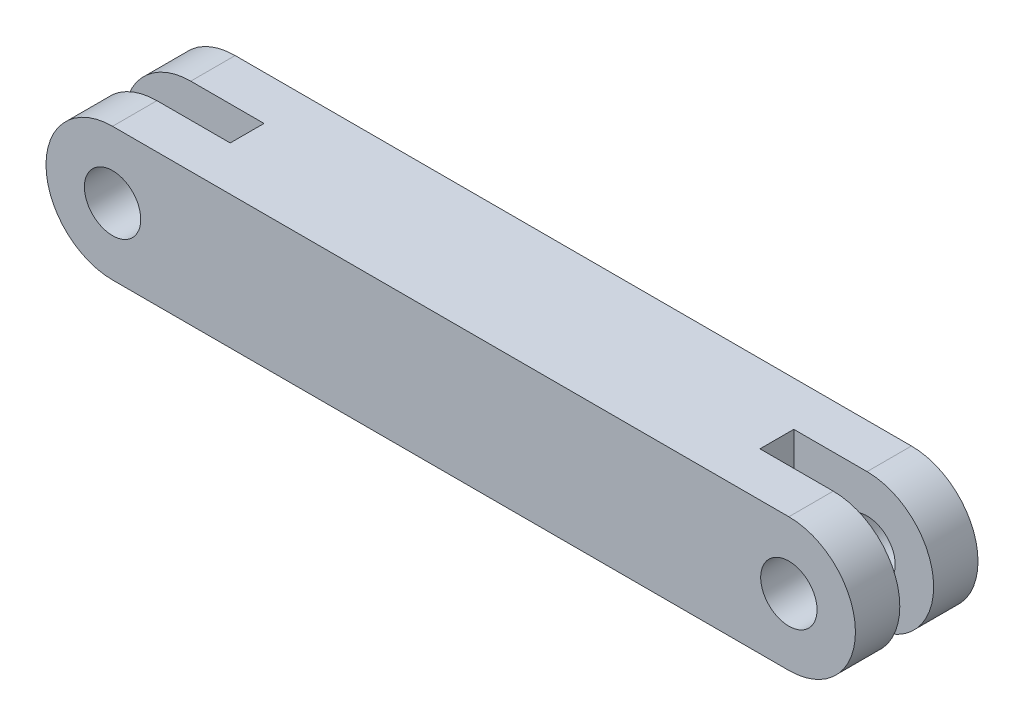
ISO-10303-21;
HEADER;
FILE_DESCRIPTION(('STEP AP214'),'2;1');
FILE_NAME('part.step','',(''),(''),'','','');
FILE_SCHEMA(('AUTOMOTIVE_DESIGN { 1 0 10303 214 1 1 1 1 }'));
ENDSEC;
DATA;
#1=APPLICATION_CONTEXT('core data for automotive mechanical design processes');
#2=APPLICATION_PROTOCOL_DEFINITION('international standard','automotive_design',2000,#1);
#3=PRODUCT_CONTEXT('',#1,'mechanical');
#4=PRODUCT('Part','Part','',(#3));
#5=PRODUCT_RELATED_PRODUCT_CATEGORY('part','',(#4));
#6=PRODUCT_DEFINITION_FORMATION('','',#4);
#7=PRODUCT_DEFINITION_CONTEXT('part definition',#1,'design');
#8=PRODUCT_DEFINITION('design','',#6,#7);
#9=PRODUCT_DEFINITION_SHAPE('','',#8);
#10=(LENGTH_UNIT() NAMED_UNIT(*) SI_UNIT(.MILLI.,.METRE.));
#11=(NAMED_UNIT(*) PLANE_ANGLE_UNIT() SI_UNIT($,.RADIAN.));
#12=(NAMED_UNIT(*) SI_UNIT($,.STERADIAN.) SOLID_ANGLE_UNIT());
#13=UNCERTAINTY_MEASURE_WITH_UNIT(LENGTH_MEASURE(1.E-05),#10,'distance_accuracy_value','');
#14=(GEOMETRIC_REPRESENTATION_CONTEXT(3) GLOBAL_UNCERTAINTY_ASSIGNED_CONTEXT((#13)) GLOBAL_UNIT_ASSIGNED_CONTEXT((#10,
#11,#12)) REPRESENTATION_CONTEXT('',''));
#15=CARTESIAN_POINT('',(0.,0.,0.));
#16=DIRECTION('',(0.,0.,1.));
#17=DIRECTION('',(1.,0.,0.));
#18=AXIS2_PLACEMENT_3D('',#15,#16,#17);
#19=CARTESIAN_POINT('',(-47.2173913043478,0.423913043478259,5.));
#20=DIRECTION('',(0.,0.,1.));
#21=DIRECTION('',(1.,0.,0.));
#22=AXIS2_PLACEMENT_3D('',#19,#20,#21);
#23=PLANE('',#22);
#24=DIRECTION('',(0.,1.,0.));
#25=VECTOR('',#24,1.);
#26=CARTESIAN_POINT('',(20.7276086956522,-7.07608695652173,5.));
#27=LINE('',#26,#25);
#28=CARTESIAN_POINT('',(20.7276086956522,-7.07608695652174,5.));
#29=VERTEX_POINT('',#28);
#30=CARTESIAN_POINT('',(20.7276086956522,7.92391304347826,5.));
#31=VERTEX_POINT('',#30);
#32=EDGE_CURVE('E166',#29,#31,#27,.T.);
#33=ORIENTED_EDGE('',*,*,#32,.F.);
#34=DIRECTION('',(1.,0.,0.));
#35=VECTOR('',#34,1.);
#36=CARTESIAN_POINT('',(-47.2173913043478,-7.07608695652174,5.));
#37=LINE('',#36,#35);
#38=CARTESIAN_POINT('',(28.9826086956522,-7.07608695652174,5.));
#39=VERTEX_POINT('',#38);
#40=EDGE_CURVE('E223',#29,#39,#37,.T.);
#41=ORIENTED_EDGE('',*,*,#40,.T.);
#42=CARTESIAN_POINT('',(28.9826086956522,0.423913043478259,5.));
#43=DIRECTION('',(0.,0.,1.));
#44=DIRECTION('',(1.,0.,0.));
#45=AXIS2_PLACEMENT_3D('',#42,#43,#44);
#46=CIRCLE('',#45,7.5);
#47=CARTESIAN_POINT('',(28.9826086956522,7.92391304347826,5.));
#48=VERTEX_POINT('',#47);
#49=EDGE_CURVE('E228',#39,#48,#46,.T.);
#50=ORIENTED_EDGE('',*,*,#49,.T.);
#51=DIRECTION('',(-1.,0.,0.));
#52=VECTOR('',#51,1.);
#53=CARTESIAN_POINT('',(-47.2173913043478,7.92391304347826,5.));
#54=LINE('',#53,#52);
#55=EDGE_CURVE('E66',#48,#31,#54,.T.);
#56=ORIENTED_EDGE('',*,*,#55,.T.);
#57=EDGE_LOOP('',(#33,#41,#50,#56));
#58=FACE_BOUND('',#57,.T.);
#59=CARTESIAN_POINT('',(28.9826086956522,0.423913043478259,5.));
#60=DIRECTION('',(0.,0.,1.));
#61=DIRECTION('',(1.,0.,0.));
#62=AXIS2_PLACEMENT_3D('',#59,#60,#61);
#63=CIRCLE('',#62,3.175);
#64=CARTESIAN_POINT('',(32.1576086956522,0.423913043478259,5.));
#65=VERTEX_POINT('',#64);
#66=EDGE_CURVE('E203',#65,#65,#63,.T.);
#67=ORIENTED_EDGE('',*,*,#66,.F.);
#68=EDGE_LOOP('',(#67));
#69=FACE_BOUND('',#68,.T.);
#70=ADVANCED_FACE('F44',(#58,#69),#23,.T.);
#71=DIRECTION('',(0.,-1.,0.));
#72=VECTOR('',#71,1.);
#73=CARTESIAN_POINT('',(-38.9623913043478,-7.07608695652172,5.));
#74=LINE('',#73,#72);
#75=CARTESIAN_POINT('',(-38.9623913043478,7.92391304347826,5.));
#76=VERTEX_POINT('',#75);
#77=CARTESIAN_POINT('',(-38.9623913043478,-7.07608695652172,5.));
#78=VERTEX_POINT('',#77);
#79=EDGE_CURVE('E62',#76,#78,#74,.T.);
#80=ORIENTED_EDGE('',*,*,#79,.F.);
#81=CARTESIAN_POINT('',(-47.2173913043478,7.92391304347826,5.));
#82=VERTEX_POINT('',#81);
#83=EDGE_CURVE('E230',#76,#82,#54,.T.);
#84=ORIENTED_EDGE('',*,*,#83,.T.);
#85=CARTESIAN_POINT('',(-47.2173913043478,0.423913043478259,5.));
#86=DIRECTION('',(0.,0.,1.));
#87=DIRECTION('',(1.,0.,0.));
#88=AXIS2_PLACEMENT_3D('',#85,#86,#87);
#89=CIRCLE('',#88,7.5);
#90=CARTESIAN_POINT('',(-47.2173913043478,-7.07608695652174,5.));
#91=VERTEX_POINT('',#90);
#92=EDGE_CURVE('E220',#82,#91,#89,.T.);
#93=ORIENTED_EDGE('',*,*,#92,.T.);
#94=EDGE_CURVE('E221',#91,#78,#37,.T.);
#95=ORIENTED_EDGE('',*,*,#94,.T.);
#96=EDGE_LOOP('',(#80,#84,#93,#95));
#97=FACE_BOUND('',#96,.T.);
#98=CARTESIAN_POINT('',(-47.2173913043478,0.423913043478259,5.));
#99=DIRECTION('',(0.,0.,1.));
#100=DIRECTION('',(1.,0.,0.));
#101=AXIS2_PLACEMENT_3D('',#98,#99,#100);
#102=CIRCLE('',#101,3.175);
#103=CARTESIAN_POINT('',(-44.0423913043478,0.423913043478259,5.));
#104=VERTEX_POINT('',#103);
#105=EDGE_CURVE('E209',#104,#104,#102,.T.);
#106=ORIENTED_EDGE('',*,*,#105,.F.);
#107=EDGE_LOOP('',(#106));
#108=FACE_BOUND('',#107,.T.);
#109=ADVANCED_FACE('F267',(#97,#108),#23,.T.);
#110=CARTESIAN_POINT('',(-47.2173913043478,0.423913043478259,0.));
#111=DIRECTION('',(0.,0.,1.));
#112=DIRECTION('',(1.,0.,0.));
#113=AXIS2_PLACEMENT_3D('',#110,#111,#112);
#114=PLANE('',#113);
#115=CARTESIAN_POINT('',(-47.2173913043478,0.423913043478259,0.));
#116=DIRECTION('',(0.,0.,1.));
#117=DIRECTION('',(1.,0.,0.));
#118=AXIS2_PLACEMENT_3D('',#115,#116,#117);
#119=CIRCLE('',#118,7.5);
#120=CARTESIAN_POINT('',(-47.2173913043478,7.92391304347826,0.));
#121=VERTEX_POINT('',#120);
#122=CARTESIAN_POINT('',(-47.2173913043478,-7.07608695652174,0.));
#123=VERTEX_POINT('',#122);
#124=EDGE_CURVE('E214',#121,#123,#119,.T.);
#125=ORIENTED_EDGE('',*,*,#124,.F.);
#126=DIRECTION('',(-1.,0.,0.));
#127=VECTOR('',#126,1.);
#128=CARTESIAN_POINT('',(-47.2173913043478,7.92391304347826,0.));
#129=LINE('',#128,#127);
#130=CARTESIAN_POINT('',(28.9826086956522,7.92391304347826,0.));
#131=VERTEX_POINT('',#130);
#132=EDGE_CURVE('E225',#131,#121,#129,.T.);
#133=ORIENTED_EDGE('',*,*,#132,.F.);
#134=CARTESIAN_POINT('',(28.9826086956522,0.423913043478259,0.));
#135=DIRECTION('',(0.,0.,1.));
#136=DIRECTION('',(1.,0.,0.));
#137=AXIS2_PLACEMENT_3D('',#134,#135,#136);
#138=CIRCLE('',#137,7.5);
#139=CARTESIAN_POINT('',(28.9826086956522,-7.07608695652174,0.));
#140=VERTEX_POINT('',#139);
#141=EDGE_CURVE('E237',#140,#131,#138,.T.);
#142=ORIENTED_EDGE('',*,*,#141,.F.);
#143=DIRECTION('',(1.,0.,0.));
#144=VECTOR('',#143,1.);
#145=CARTESIAN_POINT('',(-47.2173913043478,-7.07608695652174,0.));
#146=LINE('',#145,#144);
#147=EDGE_CURVE('E236',#123,#140,#146,.T.);
#148=ORIENTED_EDGE('',*,*,#147,.F.);
#149=EDGE_LOOP('',(#125,#133,#142,#148));
#150=FACE_BOUND('',#149,.T.);
#151=CARTESIAN_POINT('',(-47.2173913043478,0.423913043478259,0.));
#152=DIRECTION('',(0.,0.,1.));
#153=DIRECTION('',(1.,0.,0.));
#154=AXIS2_PLACEMENT_3D('',#151,#152,#153);
#155=CIRCLE('',#154,3.175);
#156=CARTESIAN_POINT('',(-44.0423913043478,0.423913043478259,0.));
#157=VERTEX_POINT('',#156);
#158=EDGE_CURVE('E202',#157,#157,#155,.T.);
#159=ORIENTED_EDGE('',*,*,#158,.T.);
#160=EDGE_LOOP('',(#159));
#161=FACE_BOUND('',#160,.T.);
#162=CARTESIAN_POINT('',(28.9826086956522,0.423913043478259,0.));
#163=DIRECTION('',(0.,0.,1.));
#164=DIRECTION('',(1.,0.,0.));
#165=AXIS2_PLACEMENT_3D('',#162,#163,#164);
#166=CIRCLE('',#165,3.175);
#167=CARTESIAN_POINT('',(32.1576086956522,0.423913043478259,0.));
#168=VERTEX_POINT('',#167);
#169=EDGE_CURVE('E198',#168,#168,#166,.T.);
#170=ORIENTED_EDGE('',*,*,#169,.T.);
#171=EDGE_LOOP('',(#170));
#172=FACE_BOUND('',#171,.T.);
#173=ADVANCED_FACE('F265',(#150,#161,#172),#114,.F.);
#174=CARTESIAN_POINT('',(-47.2173913043478,0.423913043478259,5.));
#175=DIRECTION('',(0.,0.,-1.));
#176=DIRECTION('',(-1.,0.,0.));
#177=AXIS2_PLACEMENT_3D('',#174,#175,#176);
#178=CYLINDRICAL_SURFACE('',#177,7.5);
#179=ORIENTED_EDGE('',*,*,#124,.T.);
#180=DIRECTION('',(0.,0.,-1.));
#181=VECTOR('',#180,1.);
#182=CARTESIAN_POINT('',(-47.2173913043478,-7.07608695652174,5.));
#183=LINE('',#182,#181);
#184=EDGE_CURVE('E11',#91,#123,#183,.T.);
#185=ORIENTED_EDGE('',*,*,#184,.F.);
#186=ORIENTED_EDGE('',*,*,#92,.F.);
#187=DIRECTION('',(0.,0.,-1.));
#188=VECTOR('',#187,1.);
#189=CARTESIAN_POINT('',(-47.2173913043478,7.92391304347826,5.));
#190=LINE('',#189,#188);
#191=EDGE_CURVE('E235',#82,#121,#190,.T.);
#192=ORIENTED_EDGE('',*,*,#191,.T.);
#193=EDGE_LOOP('',(#179,#185,#186,#192));
#194=FACE_BOUND('',#193,.T.);
#195=ADVANCED_FACE('F50',(#194),#178,.T.);
#196=CARTESIAN_POINT('',(-47.2173913043478,-7.07608695652174,5.));
#197=DIRECTION('',(0.,1.,0.));
#198=DIRECTION('',(-1.,0.,0.));
#199=AXIS2_PLACEMENT_3D('',#196,#197,#198);
#200=PLANE('',#199);
#201=ORIENTED_EDGE('',*,*,#147,.T.);
#202=DIRECTION('',(0.,0.,-1.));
#203=VECTOR('',#202,1.);
#204=CARTESIAN_POINT('',(28.9826086956522,-7.07608695652174,5.));
#205=LINE('',#204,#203);
#206=EDGE_CURVE('E53',#39,#140,#205,.T.);
#207=ORIENTED_EDGE('',*,*,#206,.F.);
#208=ORIENTED_EDGE('',*,*,#40,.F.);
#209=DIRECTION('',(0.,0.,-1.));
#210=VECTOR('',#209,1.);
#211=CARTESIAN_POINT('',(20.7276086956522,-7.07608695652173,8.81));
#212=LINE('',#211,#210);
#213=CARTESIAN_POINT('',(20.7276086956522,-7.07608695652173,8.81));
#214=VERTEX_POINT('',#213);
#215=EDGE_CURVE('E189',#214,#29,#212,.T.);
#216=ORIENTED_EDGE('',*,*,#215,.F.);
#217=DIRECTION('',(1.,0.,0.));
#218=VECTOR('',#217,1.);
#219=CARTESIAN_POINT('',(-47.2173913043478,-7.07608695652174,8.81));
#220=LINE('',#219,#218);
#221=CARTESIAN_POINT('',(28.9826086956522,-7.07608695652174,8.81));
#222=VERTEX_POINT('',#221);
#223=EDGE_CURVE('E281',#214,#222,#220,.T.);
#224=ORIENTED_EDGE('',*,*,#223,.T.);
#225=DIRECTION('',(0.,0.,-1.));
#226=VECTOR('',#225,1.);
#227=CARTESIAN_POINT('',(28.9826086956522,-7.07608695652174,13.81));
#228=LINE('',#227,#226);
#229=CARTESIAN_POINT('',(28.9826086956522,-7.07608695652174,13.81));
#230=VERTEX_POINT('',#229);
#231=EDGE_CURVE('E141',#230,#222,#228,.T.);
#232=ORIENTED_EDGE('',*,*,#231,.F.);
#233=DIRECTION('',(1.,0.,0.));
#234=VECTOR('',#233,1.);
#235=CARTESIAN_POINT('',(-47.2173913043478,-7.07608695652174,13.81));
#236=LINE('',#235,#234);
#237=CARTESIAN_POINT('',(-47.2173913043478,-7.07608695652174,13.81));
#238=VERTEX_POINT('',#237);
#239=EDGE_CURVE('E133',#238,#230,#236,.T.);
#240=ORIENTED_EDGE('',*,*,#239,.F.);
#241=DIRECTION('',(0.,0.,-1.));
#242=VECTOR('',#241,1.);
#243=CARTESIAN_POINT('',(-47.2173913043478,-7.07608695652174,13.81));
#244=LINE('',#243,#242);
#245=CARTESIAN_POINT('',(-47.2173913043478,-7.07608695652174,8.81));
#246=VERTEX_POINT('',#245);
#247=EDGE_CURVE('E137',#238,#246,#244,.T.);
#248=ORIENTED_EDGE('',*,*,#247,.T.);
#249=CARTESIAN_POINT('',(-38.9623913043478,-7.07608695652172,8.81));
#250=VERTEX_POINT('',#249);
#251=EDGE_CURVE('E286',#246,#250,#220,.T.);
#252=ORIENTED_EDGE('',*,*,#251,.T.);
#253=DIRECTION('',(0.,0.,-1.));
#254=VECTOR('',#253,1.);
#255=CARTESIAN_POINT('',(-38.9623913043478,-7.07608695652172,8.81));
#256=LINE('',#255,#254);
#257=EDGE_CURVE('E195',#250,#78,#256,.T.);
#258=ORIENTED_EDGE('',*,*,#257,.T.);
#259=ORIENTED_EDGE('',*,*,#94,.F.);
#260=ORIENTED_EDGE('',*,*,#184,.T.);
#261=EDGE_LOOP('',(#201,#207,#208,#216,#224,#232,#240,#248,#252,#258,#259,#260));
#262=FACE_BOUND('',#261,.T.);
#263=ADVANCED_FACE('F140',(#262),#200,.F.);
#264=CARTESIAN_POINT('',(28.9826086956522,0.423913043478259,5.));
#265=DIRECTION('',(0.,0.,-1.));
#266=DIRECTION('',(-1.,0.,0.));
#267=AXIS2_PLACEMENT_3D('',#264,#265,#266);
#268=CYLINDRICAL_SURFACE('',#267,7.5);
#269=ORIENTED_EDGE('',*,*,#141,.T.);
#270=DIRECTION('',(0.,0.,-1.));
#271=VECTOR('',#270,1.);
#272=CARTESIAN_POINT('',(28.9826086956522,7.92391304347826,5.));
#273=LINE('',#272,#271);
#274=EDGE_CURVE('E250',#48,#131,#273,.T.);
#275=ORIENTED_EDGE('',*,*,#274,.F.);
#276=ORIENTED_EDGE('',*,*,#49,.F.);
#277=ORIENTED_EDGE('',*,*,#206,.T.);
#278=EDGE_LOOP('',(#269,#275,#276,#277));
#279=FACE_BOUND('',#278,.T.);
#280=ADVANCED_FACE('F257',(#279),#268,.T.);
#281=CARTESIAN_POINT('',(-47.2173913043478,7.92391304347826,5.));
#282=DIRECTION('',(0.,-1.,0.));
#283=DIRECTION('',(0.,0.,-1.));
#284=AXIS2_PLACEMENT_3D('',#281,#282,#283);
#285=PLANE('',#284);
#286=ORIENTED_EDGE('',*,*,#132,.T.);
#287=ORIENTED_EDGE('',*,*,#191,.F.);
#288=ORIENTED_EDGE('',*,*,#83,.F.);
#289=DIRECTION('',(0.,0.,-1.));
#290=VECTOR('',#289,1.);
#291=CARTESIAN_POINT('',(-38.9623913043478,7.92391304347824,8.81));
#292=LINE('',#291,#290);
#293=CARTESIAN_POINT('',(-38.9623913043478,7.92391304347824,8.81));
#294=VERTEX_POINT('',#293);
#295=EDGE_CURVE('E197',#294,#76,#292,.T.);
#296=ORIENTED_EDGE('',*,*,#295,.F.);
#297=DIRECTION('',(-1.,0.,0.));
#298=VECTOR('',#297,1.);
#299=CARTESIAN_POINT('',(-47.2173913043478,7.92391304347826,8.81));
#300=LINE('',#299,#298);
#301=CARTESIAN_POINT('',(-47.2173913043478,7.92391304347826,8.81));
#302=VERTEX_POINT('',#301);
#303=EDGE_CURVE('E296',#294,#302,#300,.T.);
#304=ORIENTED_EDGE('',*,*,#303,.T.);
#305=DIRECTION('',(0.,0.,-1.));
#306=VECTOR('',#305,1.);
#307=CARTESIAN_POINT('',(-47.2173913043478,7.92391304347826,13.81));
#308=LINE('',#307,#306);
#309=CARTESIAN_POINT('',(-47.2173913043478,7.92391304347826,13.81));
#310=VERTEX_POINT('',#309);
#311=EDGE_CURVE('E301',#310,#302,#308,.T.);
#312=ORIENTED_EDGE('',*,*,#311,.F.);
#313=DIRECTION('',(-1.,0.,0.));
#314=VECTOR('',#313,1.);
#315=CARTESIAN_POINT('',(-47.2173913043478,7.92391304347826,13.81));
#316=LINE('',#315,#314);
#317=CARTESIAN_POINT('',(28.9826086956522,7.92391304347826,13.81));
#318=VERTEX_POINT('',#317);
#319=EDGE_CURVE('E151',#318,#310,#316,.T.);
#320=ORIENTED_EDGE('',*,*,#319,.F.);
#321=DIRECTION('',(0.,0.,-1.));
#322=VECTOR('',#321,1.);
#323=CARTESIAN_POINT('',(28.9826086956522,7.92391304347826,13.81));
#324=LINE('',#323,#322);
#325=CARTESIAN_POINT('',(28.9826086956522,7.92391304347826,8.81));
#326=VERTEX_POINT('',#325);
#327=EDGE_CURVE('E167',#318,#326,#324,.T.);
#328=ORIENTED_EDGE('',*,*,#327,.T.);
#329=CARTESIAN_POINT('',(20.7276086956522,7.92391304347826,8.81));
#330=VERTEX_POINT('',#329);
#331=EDGE_CURVE('E159',#326,#330,#300,.T.);
#332=ORIENTED_EDGE('',*,*,#331,.T.);
#333=DIRECTION('',(0.,0.,-1.));
#334=VECTOR('',#333,1.);
#335=CARTESIAN_POINT('',(20.7276086956522,7.92391304347826,8.81));
#336=LINE('',#335,#334);
#337=EDGE_CURVE('E181',#330,#31,#336,.T.);
#338=ORIENTED_EDGE('',*,*,#337,.T.);
#339=ORIENTED_EDGE('',*,*,#55,.F.);
#340=ORIENTED_EDGE('',*,*,#274,.T.);
#341=EDGE_LOOP('',(#286,#287,#288,#296,#304,#312,#320,#328,#332,#338,#339,#340));
#342=FACE_BOUND('',#341,.T.);
#343=ADVANCED_FACE('F268',(#342),#285,.F.);
#344=CARTESIAN_POINT('',(-47.2173913043478,0.423913043478259,5.));
#345=DIRECTION('',(0.,0.,-1.));
#346=DIRECTION('',(-1.,0.,0.));
#347=AXIS2_PLACEMENT_3D('',#344,#345,#346);
#348=CYLINDRICAL_SURFACE('',#347,3.175);
#349=ORIENTED_EDGE('',*,*,#105,.T.);
#350=EDGE_LOOP('',(#349));
#351=FACE_BOUND('',#350,.T.);
#352=ORIENTED_EDGE('',*,*,#158,.F.);
#353=EDGE_LOOP('',(#352));
#354=FACE_BOUND('',#353,.T.);
#355=ADVANCED_FACE('F353',(#351,#354),#348,.F.);
#356=CARTESIAN_POINT('',(28.9826086956522,0.423913043478259,5.));
#357=DIRECTION('',(0.,0.,-1.));
#358=DIRECTION('',(-1.,0.,0.));
#359=AXIS2_PLACEMENT_3D('',#356,#357,#358);
#360=CYLINDRICAL_SURFACE('',#359,3.175);
#361=ORIENTED_EDGE('',*,*,#66,.T.);
#362=EDGE_LOOP('',(#361));
#363=FACE_BOUND('',#362,.T.);
#364=ORIENTED_EDGE('',*,*,#169,.F.);
#365=EDGE_LOOP('',(#364));
#366=FACE_BOUND('',#365,.T.);
#367=ADVANCED_FACE('F378',(#363,#366),#360,.F.);
#368=CARTESIAN_POINT('',(-38.9623913043478,-7.07608695652172,8.81));
#369=DIRECTION('',(1.,0.,0.));
#370=DIRECTION('',(0.,0.,-1.));
#371=AXIS2_PLACEMENT_3D('',#368,#369,#370);
#372=PLANE('',#371);
#373=ORIENTED_EDGE('',*,*,#79,.T.);
#374=ORIENTED_EDGE('',*,*,#257,.F.);
#375=DIRECTION('',(0.,-1.,0.));
#376=VECTOR('',#375,1.);
#377=CARTESIAN_POINT('',(-38.9623913043478,-7.07608695652172,8.81));
#378=LINE('',#377,#376);
#379=EDGE_CURVE('E172',#294,#250,#378,.T.);
#380=ORIENTED_EDGE('',*,*,#379,.F.);
#381=ORIENTED_EDGE('',*,*,#295,.T.);
#382=EDGE_LOOP('',(#373,#374,#380,#381));
#383=FACE_BOUND('',#382,.T.);
#384=ADVANCED_FACE('F387',(#383),#372,.F.);
#385=CARTESIAN_POINT('',(20.7276086956522,-7.07608695652173,8.81));
#386=DIRECTION('',(-1.,0.,0.));
#387=DIRECTION('',(0.,0.,1.));
#388=AXIS2_PLACEMENT_3D('',#385,#386,#387);
#389=PLANE('',#388);
#390=ORIENTED_EDGE('',*,*,#32,.T.);
#391=ORIENTED_EDGE('',*,*,#337,.F.);
#392=DIRECTION('',(0.,1.,0.));
#393=VECTOR('',#392,1.);
#394=CARTESIAN_POINT('',(20.7276086956522,-7.07608695652173,8.81));
#395=LINE('',#394,#393);
#396=EDGE_CURVE('E178',#214,#330,#395,.T.);
#397=ORIENTED_EDGE('',*,*,#396,.F.);
#398=ORIENTED_EDGE('',*,*,#215,.T.);
#399=EDGE_LOOP('',(#390,#391,#397,#398));
#400=FACE_BOUND('',#399,.T.);
#401=ADVANCED_FACE('F279',(#400),#389,.F.);
#402=CARTESIAN_POINT('',(-47.2173913043478,0.423913043478259,8.81));
#403=DIRECTION('',(0.,0.,1.));
#404=DIRECTION('',(1.,0.,0.));
#405=AXIS2_PLACEMENT_3D('',#402,#403,#404);
#406=PLANE('',#405);
#407=CARTESIAN_POINT('',(-47.2173913043478,0.423913043478259,8.81));
#408=DIRECTION('',(0.,0.,1.));
#409=DIRECTION('',(1.,0.,0.));
#410=AXIS2_PLACEMENT_3D('',#407,#408,#409);
#411=CIRCLE('',#410,3.175);
#412=CARTESIAN_POINT('',(-44.0423913043478,0.423913043478259,8.81));
#413=VERTEX_POINT('',#412);
#414=EDGE_CURVE('E315',#413,#413,#411,.T.);
#415=ORIENTED_EDGE('',*,*,#414,.T.);
#416=EDGE_LOOP('',(#415));
#417=FACE_BOUND('',#416,.T.);
#418=ORIENTED_EDGE('',*,*,#303,.F.);
#419=ORIENTED_EDGE('',*,*,#379,.T.);
#420=ORIENTED_EDGE('',*,*,#251,.F.);
#421=CARTESIAN_POINT('',(-47.2173913043478,0.423913043478259,8.81));
#422=DIRECTION('',(0.,0.,1.));
#423=DIRECTION('',(1.,0.,0.));
#424=AXIS2_PLACEMENT_3D('',#421,#422,#423);
#425=CIRCLE('',#424,7.5);
#426=EDGE_CURVE('E161',#302,#246,#425,.T.);
#427=ORIENTED_EDGE('',*,*,#426,.F.);
#428=EDGE_LOOP('',(#418,#419,#420,#427));
#429=FACE_BOUND('',#428,.T.);
#430=ADVANCED_FACE('F336',(#417,#429),#406,.F.);
#431=CARTESIAN_POINT('',(28.9826086956522,0.423913043478259,8.81));
#432=DIRECTION('',(0.,0.,1.));
#433=DIRECTION('',(1.,0.,0.));
#434=AXIS2_PLACEMENT_3D('',#431,#432,#433);
#435=CIRCLE('',#434,3.175);
#436=CARTESIAN_POINT('',(32.1576086956522,0.423913043478259,8.81));
#437=VERTEX_POINT('',#436);
#438=EDGE_CURVE('E318',#437,#437,#435,.T.);
#439=ORIENTED_EDGE('',*,*,#438,.T.);
#440=EDGE_LOOP('',(#439));
#441=FACE_BOUND('',#440,.T.);
#442=ORIENTED_EDGE('',*,*,#223,.F.);
#443=ORIENTED_EDGE('',*,*,#396,.T.);
#444=ORIENTED_EDGE('',*,*,#331,.F.);
#445=CARTESIAN_POINT('',(28.9826086956522,0.423913043478259,8.81));
#446=DIRECTION('',(0.,0.,1.));
#447=DIRECTION('',(1.,0.,0.));
#448=AXIS2_PLACEMENT_3D('',#445,#446,#447);
#449=CIRCLE('',#448,7.5);
#450=EDGE_CURVE('E288',#222,#326,#449,.T.);
#451=ORIENTED_EDGE('',*,*,#450,.F.);
#452=EDGE_LOOP('',(#442,#443,#444,#451));
#453=FACE_BOUND('',#452,.T.);
#454=ADVANCED_FACE('F283',(#441,#453),#406,.F.);
#455=CARTESIAN_POINT('',(-47.2173913043478,0.423913043478259,13.81));
#456=DIRECTION('',(0.,0.,1.));
#457=DIRECTION('',(1.,0.,0.));
#458=AXIS2_PLACEMENT_3D('',#455,#456,#457);
#459=PLANE('',#458);
#460=CARTESIAN_POINT('',(-47.2173913043478,0.423913043478259,13.81));
#461=DIRECTION('',(0.,0.,1.));
#462=DIRECTION('',(1.,0.,0.));
#463=AXIS2_PLACEMENT_3D('',#460,#461,#462);
#464=CIRCLE('',#463,3.175);
#465=CARTESIAN_POINT('',(-44.0423913043478,0.423913043478259,13.81));
#466=VERTEX_POINT('',#465);
#467=EDGE_CURVE('E292',#466,#466,#464,.T.);
#468=ORIENTED_EDGE('',*,*,#467,.F.);
#469=EDGE_LOOP('',(#468));
#470=FACE_BOUND('',#469,.T.);
#471=CARTESIAN_POINT('',(-47.2173913043478,0.423913043478259,13.81));
#472=DIRECTION('',(0.,0.,1.));
#473=DIRECTION('',(1.,0.,0.));
#474=AXIS2_PLACEMENT_3D('',#471,#472,#473);
#475=CIRCLE('',#474,7.5);
#476=EDGE_CURVE('E149',#310,#238,#475,.T.);
#477=ORIENTED_EDGE('',*,*,#476,.T.);
#478=ORIENTED_EDGE('',*,*,#239,.T.);
#479=CARTESIAN_POINT('',(28.9826086956522,0.423913043478259,13.81));
#480=DIRECTION('',(0.,0.,1.));
#481=DIRECTION('',(1.,0.,0.));
#482=AXIS2_PLACEMENT_3D('',#479,#480,#481);
#483=CIRCLE('',#482,7.5);
#484=EDGE_CURVE('E150',#230,#318,#483,.T.);
#485=ORIENTED_EDGE('',*,*,#484,.T.);
#486=ORIENTED_EDGE('',*,*,#319,.T.);
#487=EDGE_LOOP('',(#477,#478,#485,#486));
#488=FACE_BOUND('',#487,.T.);
#489=CARTESIAN_POINT('',(28.9826086956522,0.423913043478259,13.81));
#490=DIRECTION('',(0.,0.,1.));
#491=DIRECTION('',(1.,0.,0.));
#492=AXIS2_PLACEMENT_3D('',#489,#490,#491);
#493=CIRCLE('',#492,3.175);
#494=CARTESIAN_POINT('',(32.1576086956522,0.423913043478259,13.81));
#495=VERTEX_POINT('',#494);
#496=EDGE_CURVE('E317',#495,#495,#493,.T.);
#497=ORIENTED_EDGE('',*,*,#496,.F.);
#498=EDGE_LOOP('',(#497));
#499=FACE_BOUND('',#498,.T.);
#500=ADVANCED_FACE('F152',(#470,#488,#499),#459,.T.);
#501=CARTESIAN_POINT('',(-47.2173913043478,0.423913043478259,13.81));
#502=DIRECTION('',(0.,0.,-1.));
#503=DIRECTION('',(-1.,0.,0.));
#504=AXIS2_PLACEMENT_3D('',#501,#502,#503);
#505=CYLINDRICAL_SURFACE('',#504,7.5);
#506=ORIENTED_EDGE('',*,*,#426,.T.);
#507=ORIENTED_EDGE('',*,*,#247,.F.);
#508=ORIENTED_EDGE('',*,*,#476,.F.);
#509=ORIENTED_EDGE('',*,*,#311,.T.);
#510=EDGE_LOOP('',(#506,#507,#508,#509));
#511=FACE_BOUND('',#510,.T.);
#512=ADVANCED_FACE('F163',(#511),#505,.T.);
#513=CARTESIAN_POINT('',(28.9826086956522,0.423913043478259,13.81));
#514=DIRECTION('',(0.,0.,-1.));
#515=DIRECTION('',(-1.,0.,0.));
#516=AXIS2_PLACEMENT_3D('',#513,#514,#515);
#517=CYLINDRICAL_SURFACE('',#516,7.5);
#518=ORIENTED_EDGE('',*,*,#450,.T.);
#519=ORIENTED_EDGE('',*,*,#327,.F.);
#520=ORIENTED_EDGE('',*,*,#484,.F.);
#521=ORIENTED_EDGE('',*,*,#231,.T.);
#522=EDGE_LOOP('',(#518,#519,#520,#521));
#523=FACE_BOUND('',#522,.T.);
#524=ADVANCED_FACE('F310',(#523),#517,.T.);
#525=CARTESIAN_POINT('',(-47.2173913043478,0.423913043478259,13.81));
#526=DIRECTION('',(0.,0.,-1.));
#527=DIRECTION('',(-1.,0.,0.));
#528=AXIS2_PLACEMENT_3D('',#525,#526,#527);
#529=CYLINDRICAL_SURFACE('',#528,3.175);
#530=ORIENTED_EDGE('',*,*,#467,.T.);
#531=EDGE_LOOP('',(#530));
#532=FACE_BOUND('',#531,.T.);
#533=ORIENTED_EDGE('',*,*,#414,.F.);
#534=EDGE_LOOP('',(#533));
#535=FACE_BOUND('',#534,.T.);
#536=ADVANCED_FACE('F456',(#532,#535),#529,.F.);
#537=CARTESIAN_POINT('',(28.9826086956522,0.423913043478259,13.81));
#538=DIRECTION('',(0.,0.,-1.));
#539=DIRECTION('',(-1.,0.,0.));
#540=AXIS2_PLACEMENT_3D('',#537,#538,#539);
#541=CYLINDRICAL_SURFACE('',#540,3.175);
#542=ORIENTED_EDGE('',*,*,#496,.T.);
#543=EDGE_LOOP('',(#542));
#544=FACE_BOUND('',#543,.T.);
#545=ORIENTED_EDGE('',*,*,#438,.F.);
#546=EDGE_LOOP('',(#545));
#547=FACE_BOUND('',#546,.T.);
#548=ADVANCED_FACE('F329',(#544,#547),#541,.F.);
#549=CLOSED_SHELL('',(#70,#109,#173,#195,#263,#280,#343,#355,#367,#384,#401,#430,#454,#500,#512,
#524,#536,#548));
#550=MANIFOLD_SOLID_BREP('B2',#549);
#551=ADVANCED_BREP_SHAPE_REPRESENTATION('',(#18,#550),#14);
#552=SHAPE_DEFINITION_REPRESENTATION(#9,#551);
ENDSEC;
END-ISO-10303-21;
